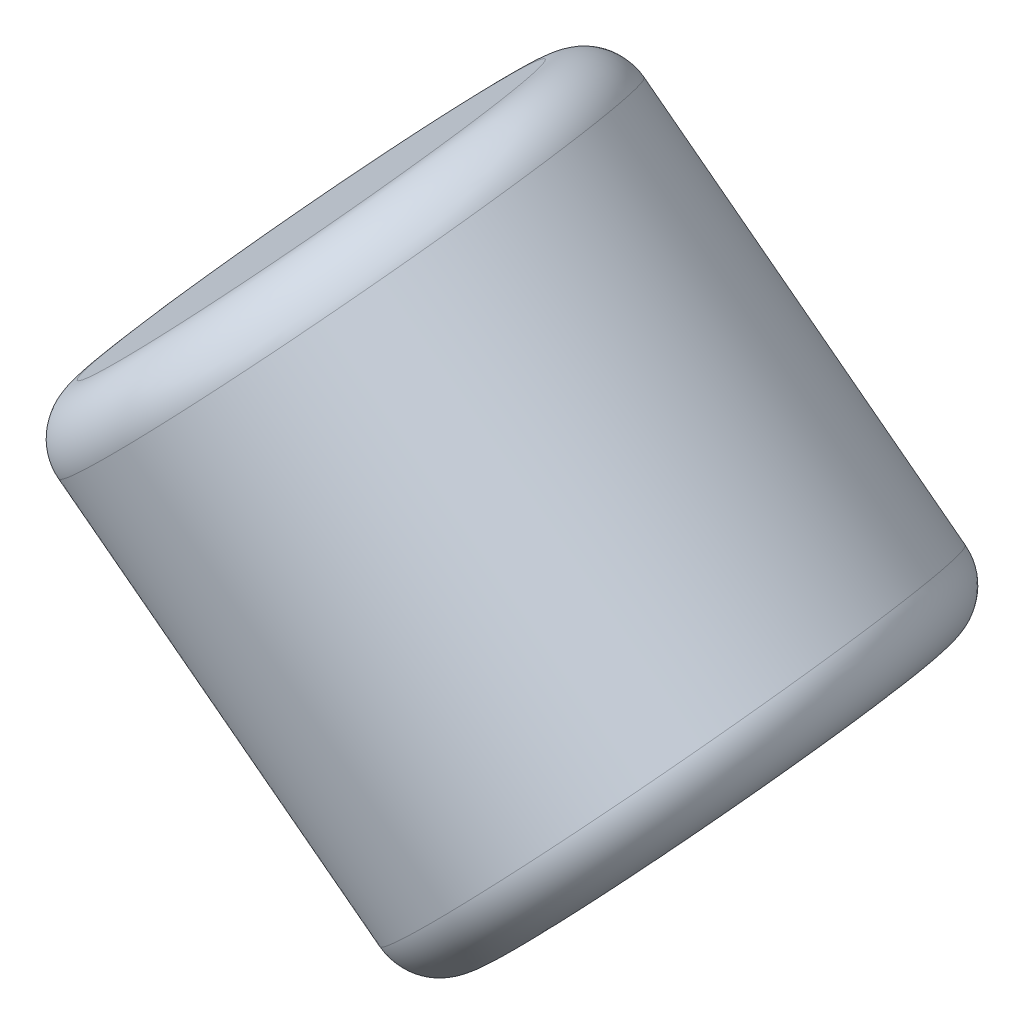
ISO-10303-21;
HEADER;
FILE_DESCRIPTION(('STEP AP214'),'2;1');
FILE_NAME('part.step','',(''),(''),'','','');
FILE_SCHEMA(('AUTOMOTIVE_DESIGN { 1 0 10303 214 1 1 1 1 }'));
ENDSEC;
DATA;
#1=APPLICATION_CONTEXT('core data for automotive mechanical design processes');
#2=APPLICATION_PROTOCOL_DEFINITION('international standard','automotive_design',2000,#1);
#3=PRODUCT_CONTEXT('',#1,'mechanical');
#4=PRODUCT('Part','Part','',(#3));
#5=PRODUCT_RELATED_PRODUCT_CATEGORY('part','',(#4));
#6=PRODUCT_DEFINITION_FORMATION('','',#4);
#7=PRODUCT_DEFINITION_CONTEXT('part definition',#1,'design');
#8=PRODUCT_DEFINITION('design','',#6,#7);
#9=PRODUCT_DEFINITION_SHAPE('','',#8);
#10=(LENGTH_UNIT() NAMED_UNIT(*) SI_UNIT(.MILLI.,.METRE.));
#11=(NAMED_UNIT(*) PLANE_ANGLE_UNIT() SI_UNIT($,.RADIAN.));
#12=(NAMED_UNIT(*) SI_UNIT($,.STERADIAN.) SOLID_ANGLE_UNIT());
#13=UNCERTAINTY_MEASURE_WITH_UNIT(LENGTH_MEASURE(1.E-05),#10,'distance_accuracy_value','');
#14=(GEOMETRIC_REPRESENTATION_CONTEXT(3) GLOBAL_UNCERTAINTY_ASSIGNED_CONTEXT((#13)) GLOBAL_UNIT_ASSIGNED_CONTEXT((#10,
#11,#12)) REPRESENTATION_CONTEXT('',''));
#15=CARTESIAN_POINT('',(0.,0.,0.));
#16=DIRECTION('',(0.,0.,1.));
#17=DIRECTION('',(1.,0.,0.));
#18=AXIS2_PLACEMENT_3D('',#15,#16,#17);
#19=CARTESIAN_POINT('',(3.20710678118655,26.4149595739233,3.47759540157704));
#20=DIRECTION('',(-0.707106781186298,0.701057384650226,0.0922959556412889));
#21=DIRECTION('',(-0.704062592219887,-0.710137920573611,0.));
#22=AXIS2_PLACEMENT_3D('',#19,#20,#21);
#23=PLANE('',#22);
#24=CARTESIAN_POINT('',(3.20710678118655,26.4149595739233,3.47759540157705));
#25=DIRECTION('',(-0.707106781186298,0.701057384650226,0.0922959556412889));
#26=DIRECTION('',(-0.704062592219888,-0.710137920573611,0.));
#27=AXIS2_PLACEMENT_3D('',#24,#25,#26);
#28=CIRCLE('',#27,0.79999999999822);
#29=CARTESIAN_POINT('',(2.64385670741189,25.8468492374656,3.47759540157705));
#30=VERTEX_POINT('',#29);
#31=EDGE_CURVE('E30',#30,#30,#28,.T.);
#32=ORIENTED_EDGE('',*,*,#31,.F.);
#33=EDGE_LOOP('',(#32));
#34=FACE_BOUND('',#33,.T.);
#35=ADVANCED_FACE('F15',(#34),#23,.F.);
#36=CARTESIAN_POINT('',(3.06568542494818,26.5551710508544,3.49605459270545));
#37=DIRECTION('',(-0.707106781186298,0.701057384650226,0.0922959556412889));
#38=DIRECTION('',(-0.704062592219888,-0.710137920573611,0.));
#39=AXIS2_PLACEMENT_3D('',#36,#37,#38);
#40=TOROIDAL_SURFACE('',#39,0.79999999999822,0.20000000000164);
#41=ORIENTED_EDGE('',*,*,#31,.T.);
#42=EDGE_LOOP('',(#41));
#43=FACE_BOUND('',#42,.T.);
#44=CARTESIAN_POINT('',(3.06568542494942,26.5551710508532,3.49605459270529));
#45=DIRECTION('',(-0.707106781186298,0.701057384650226,0.0922959556412889));
#46=DIRECTION('',(-0.704062592219888,-0.710137920573611,0.));
#47=AXIS2_PLACEMENT_3D('',#44,#45,#46);
#48=CIRCLE('',#47,0.999999999999884);
#49=CARTESIAN_POINT('',(2.36162283272955,25.8450331302796,3.49605459270529));
#50=VERTEX_POINT('',#49);
#51=EDGE_CURVE('E26',#50,#50,#48,.T.);
#52=ORIENTED_EDGE('',*,*,#51,.F.);
#53=EDGE_LOOP('',(#52));
#54=FACE_BOUND('',#53,.T.);
#55=ADVANCED_FACE('F36',(#43,#54),#40,.T.);
#56=CARTESIAN_POINT('',(1.7928932188135,27.8170743432241,3.66218731285969));
#57=DIRECTION('',(-0.707106781186298,0.701057384650226,0.0922959556412889));
#58=DIRECTION('',(-0.704062592219888,-0.710137920573611,0.));
#59=AXIS2_PLACEMENT_3D('',#56,#57,#58);
#60=CYLINDRICAL_SURFACE('',#59,0.999999999999967);
#61=CARTESIAN_POINT('',(1.93431457505106,27.6768628662938,3.64372812173139));
#62=DIRECTION('',(-0.707106781186298,0.701057384650226,0.0922959556412889));
#63=DIRECTION('',(-0.704062592219887,-0.710137920573611,0.));
#64=AXIS2_PLACEMENT_3D('',#61,#62,#63);
#65=CIRCLE('',#64,1.00000000000008);
#66=CARTESIAN_POINT('',(1.23025198283119,26.9667249457202,3.64372812173139));
#67=VERTEX_POINT('',#66);
#68=EDGE_CURVE('E22',#67,#67,#65,.T.);
#69=CARTESIAN_POINT('',(1.23025198283119,26.9667249457202,3.64372812173139));
#70=CARTESIAN_POINT('',(1.24203709585097,26.955040655976,3.64218985580403));
#71=CARTESIAN_POINT('',(1.25382220887074,26.9433563662319,3.64065158987668));
#72=CARTESIAN_POINT('',(1.27739243491029,26.9199877867435,3.63757505802197));
#73=CARTESIAN_POINT('',(1.28917754793007,26.9083034969994,3.63603679209461));
#74=CARTESIAN_POINT('',(1.31274777396962,26.884934917511,3.6329602602399));
#75=CARTESIAN_POINT('',(1.32453288698939,26.8732506277668,3.63142199431255));
#76=CARTESIAN_POINT('',(1.34810311302894,26.8498820482785,3.62834546245784));
#77=CARTESIAN_POINT('',(1.35988822604872,26.8381977585343,3.62680719653048));
#78=CARTESIAN_POINT('',(1.38345845208826,26.814829179046,3.62373066467577));
#79=CARTESIAN_POINT('',(1.39524356510804,26.8031448893018,3.62219239874842));
#80=CARTESIAN_POINT('',(1.41881379114759,26.7797763098134,3.6191158668937));
#81=CARTESIAN_POINT('',(1.43059890416736,26.7680920200693,3.61757760096635));
#82=CARTESIAN_POINT('',(1.45416913020691,26.7447234405809,3.61450106911164));
#83=CARTESIAN_POINT('',(1.46595424322668,26.7330391508368,3.61296280318428));
#84=CARTESIAN_POINT('',(1.48952446926623,26.7096705713484,3.60988627132957));
#85=CARTESIAN_POINT('',(1.50130958228601,26.6979862816042,3.60834800540222));
#86=CARTESIAN_POINT('',(1.52487980832556,26.6746177021159,3.60527147354751));
#87=CARTESIAN_POINT('',(1.53666492134533,26.6629334123717,3.60373320762015));
#88=CARTESIAN_POINT('',(1.56023514738488,26.6395648328834,3.60065667576544));
#89=CARTESIAN_POINT('',(1.57202026040466,26.6278805431392,3.59911840983809));
#90=CARTESIAN_POINT('',(1.59559048644421,26.6045119636508,3.59604187798338));
#91=CARTESIAN_POINT('',(1.60737559946398,26.5928276739067,3.59450361205602));
#92=CARTESIAN_POINT('',(1.63094582550353,26.5694590944183,3.59142708020131));
#93=CARTESIAN_POINT('',(1.6427309385233,26.5577748046742,3.58988881427396));
#94=CARTESIAN_POINT('',(1.66630116456285,26.5344062251858,3.58681228241925));
#95=CARTESIAN_POINT('',(1.67808627758263,26.5227219354416,3.58527401649189));
#96=CARTESIAN_POINT('',(1.70165650362218,26.4993533559533,3.58219748463718));
#97=CARTESIAN_POINT('',(1.71344161664195,26.4876690662091,3.58065921870982));
#98=CARTESIAN_POINT('',(1.7370118426815,26.4643004867208,3.57758268685511));
#99=CARTESIAN_POINT('',(1.74879695570127,26.4526161969766,3.57604442092776));
#100=CARTESIAN_POINT('',(1.77236718174082,26.4292476174882,3.57296788907305));
#101=CARTESIAN_POINT('',(1.7841522947606,26.4175633277441,3.57142962314569));
#102=CARTESIAN_POINT('',(1.80772252080015,26.3941947482557,3.56835309129098));
#103=CARTESIAN_POINT('',(1.81950763381992,26.3825104585116,3.56681482536363));
#104=CARTESIAN_POINT('',(1.84307785985947,26.3591418790232,3.56373829350892));
#105=CARTESIAN_POINT('',(1.85486297287925,26.347457589279,3.56220002758156));
#106=CARTESIAN_POINT('',(1.87843319891879,26.3240890097907,3.55912349572685));
#107=CARTESIAN_POINT('',(1.89021831193857,26.3124047200465,3.5575852297995));
#108=CARTESIAN_POINT('',(1.91378853797812,26.2890361405582,3.55450869794479));
#109=CARTESIAN_POINT('',(1.92557365099789,26.277351850814,3.55297043201743));
#110=CARTESIAN_POINT('',(1.94914387703744,26.2539832713256,3.54989390016272));
#111=CARTESIAN_POINT('',(1.96092899005722,26.2422989815815,3.54835563423537));
#112=CARTESIAN_POINT('',(1.98449921609677,26.2189304020931,3.54527910238066));
#113=CARTESIAN_POINT('',(1.99628432911654,26.207246112349,3.5437408364533));
#114=CARTESIAN_POINT('',(2.01985455515609,26.1838775328606,3.54066430459859));
#115=CARTESIAN_POINT('',(2.03163966817586,26.1721932431164,3.53912603867124));
#116=CARTESIAN_POINT('',(2.05520989421541,26.1488246636281,3.53604950681652));
#117=CARTESIAN_POINT('',(2.06699500723519,26.1371403738839,3.53451124088917));
#118=CARTESIAN_POINT('',(2.09056523327474,26.1137717943956,3.53143470903446));
#119=CARTESIAN_POINT('',(2.10235034629451,26.1020875046514,3.5298964431071));
#120=CARTESIAN_POINT('',(2.12592057233406,26.078718925163,3.52681991125239));
#121=CARTESIAN_POINT('',(2.13770568535383,26.0670346354189,3.52528164532504));
#122=CARTESIAN_POINT('',(2.16127591139338,26.0436660559305,3.52220511347033));
#123=CARTESIAN_POINT('',(2.17306102441316,26.0319817661864,3.52066684754297));
#124=CARTESIAN_POINT('',(2.19663125045271,26.008613186698,3.51759031568826));
#125=CARTESIAN_POINT('',(2.20841636347248,25.9969288969538,3.51605204976091));
#126=CARTESIAN_POINT('',(2.23198658951203,25.9735603174655,3.5129755179062));
#127=CARTESIAN_POINT('',(2.24377170253181,25.9618760277213,3.51143725197884));
#128=CARTESIAN_POINT('',(2.26734192857136,25.938507448233,3.50836072012413));
#129=CARTESIAN_POINT('',(2.27912704159113,25.9268231584888,3.50682245419678));
#130=CARTESIAN_POINT('',(2.30269726763068,25.9034545790004,3.50374592234207));
#131=CARTESIAN_POINT('',(2.31448238065045,25.8917702892563,3.50220765641471));
#132=CARTESIAN_POINT('',(2.33805260669,25.8684017097679,3.49913112456));
#133=CARTESIAN_POINT('',(2.34983771970978,25.8567174200238,3.49759285863264));
#134=CARTESIAN_POINT('',(2.36162283272955,25.8450331302796,3.49605459270529));
#135=B_SPLINE_CURVE_WITH_KNOTS('',3,(#69,#70,#71,#72,#73,#74,#75,#76,#77,#78,#79,#80,#81,#82,
#83,#84,#85,#86,#87,#88,#89,#90,#91,#92,#93,#94,#95,#96,#97,#98,#99,#100,#101,#102,#103,#104,
#105,#106,#107,#108,#109,#110,#111,#112,#113,#114,#115,#116,#117,#118,#119,#120,#121,#122,#123,
#124,#125,#126,#127,#128,#129,#130,#131,#132,#133,#134),.UNSPECIFIED.,.F.,.F.,(4,2,2,2,2,2,2,2,
2,2,2,2,2,2,2,2,2,2,2,2,2,2,2,2,2,2,2,2,2,2,2,2,4),(0.,0.0500000000000149,0.100000000000025,
0.150000000000037,0.20000000000005,0.250000000000065,0.300000000000077,0.350000000000089,
0.400000000000099,0.450000000000114,0.500000000000127,0.550000000000136,0.600000000000151,
0.650000000000164,0.700000000000174,0.750000000000189,0.800000000000201,0.850000000000211,
0.900000000000226,0.950000000000238,1.00000000000025,1.05000000000026,1.10000000000028,
1.15000000000029,1.2000000000003,1.25000000000031,1.30000000000033,1.35000000000034,
1.40000000000035,1.45000000000036,1.50000000000038,1.55000000000039,1.6000000000004),.UNSPECIFIED.);
#136=EDGE_CURVE('BSEAM45',#67,#50,#135,.T.);
#137=ORIENTED_EDGE('',*,*,#68,.F.);
#138=ORIENTED_EDGE('',*,*,#51,.T.);
#139=ORIENTED_EDGE('',*,*,#136,.T.);
#140=ORIENTED_EDGE('',*,*,#136,.F.);
#141=EDGE_LOOP('',(#137,#139,#138,#140));
#142=FACE_BOUND('',#141,.T.);
#143=ADVANCED_FACE('F45',(#142),#60,.T.);
#144=CARTESIAN_POINT('',(1.93431457505076,27.6768628662941,3.64372812173142));
#145=DIRECTION('',(-0.707106781186298,0.701057384650226,0.0922959556412889));
#146=DIRECTION('',(-0.704062592219888,-0.710137920573611,0.));
#147=AXIS2_PLACEMENT_3D('',#144,#145,#146);
#148=TOROIDAL_SURFACE('',#147,0.80000000000084,0.199999999999233);
#149=ORIENTED_EDGE('',*,*,#68,.T.);
#150=EDGE_LOOP('',(#149));
#151=FACE_BOUND('',#150,.T.);
#152=CARTESIAN_POINT('',(1.79289321881379,27.8170743432239,3.66218731285965));
#153=DIRECTION('',(-0.707106781186298,0.701057384650226,0.0922959556412889));
#154=DIRECTION('',(-0.704062592219888,-0.710137920573611,0.));
#155=AXIS2_PLACEMENT_3D('',#152,#153,#154);
#156=CIRCLE('',#155,0.79999994812425);
#157=CARTESIAN_POINT('',(1.22964318156166,27.2489640436039,3.66218731285964));
#158=VERTEX_POINT('',#157);
#159=EDGE_CURVE('E10',#158,#158,#156,.T.);
#160=ORIENTED_EDGE('',*,*,#159,.F.);
#161=EDGE_LOOP('',(#160));
#162=FACE_BOUND('',#161,.T.);
#163=ADVANCED_FACE('F49',(#151,#162),#148,.T.);
#164=CARTESIAN_POINT('',(1.22720779386393,27.2562284355037,3.58835054834662));
#165=DIRECTION('',(0.707106781186298,-0.701057384650226,-0.0922959556412889));
#166=DIRECTION('',(0.704062592219887,0.710137920573611,0.));
#167=AXIS2_PLACEMENT_3D('',#164,#165,#166);
#168=PLANE('',#167);
#169=ORIENTED_EDGE('',*,*,#159,.T.);
#170=EDGE_LOOP('',(#169));
#171=FACE_BOUND('',#170,.T.);
#172=ADVANCED_FACE('F17',(#171),#168,.F.);
#173=CLOSED_SHELL('',(#35,#55,#143,#163,#172));
#174=MANIFOLD_SOLID_BREP('B1',#173);
#175=ADVANCED_BREP_SHAPE_REPRESENTATION('',(#18,#174),#14);
#176=SHAPE_DEFINITION_REPRESENTATION(#9,#175);
ENDSEC;
END-ISO-10303-21;
